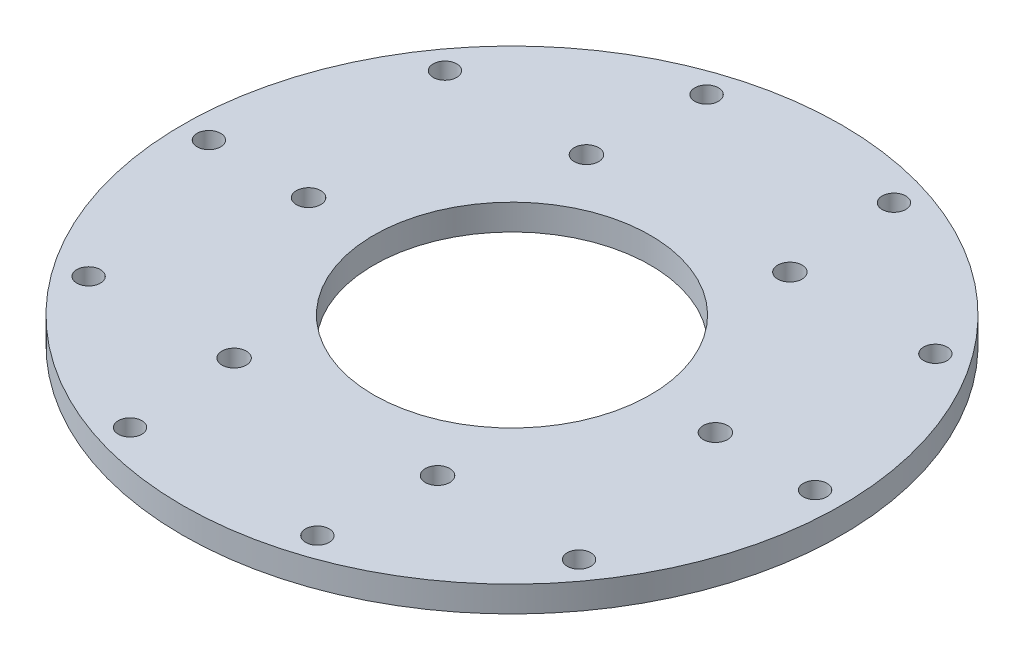
ISO-10303-21;
HEADER;
FILE_DESCRIPTION(('STEP AP214'),'2;1');
FILE_NAME('part.step','',(''),(''),'','','');
FILE_SCHEMA(('AUTOMOTIVE_DESIGN { 1 0 10303 214 1 1 1 1 }'));
ENDSEC;
DATA;
#1=APPLICATION_CONTEXT('core data for automotive mechanical design processes');
#2=APPLICATION_PROTOCOL_DEFINITION('international standard','automotive_design',2000,#1);
#3=PRODUCT_CONTEXT('',#1,'mechanical');
#4=PRODUCT('Part','Part','',(#3));
#5=PRODUCT_RELATED_PRODUCT_CATEGORY('part','',(#4));
#6=PRODUCT_DEFINITION_FORMATION('','',#4);
#7=PRODUCT_DEFINITION_CONTEXT('part definition',#1,'design');
#8=PRODUCT_DEFINITION('design','',#6,#7);
#9=PRODUCT_DEFINITION_SHAPE('','',#8);
#10=(LENGTH_UNIT() NAMED_UNIT(*) SI_UNIT(.MILLI.,.METRE.));
#11=(NAMED_UNIT(*) PLANE_ANGLE_UNIT() SI_UNIT($,.RADIAN.));
#12=(NAMED_UNIT(*) SI_UNIT($,.STERADIAN.) SOLID_ANGLE_UNIT());
#13=UNCERTAINTY_MEASURE_WITH_UNIT(LENGTH_MEASURE(1.E-05),#10,'distance_accuracy_value','');
#14=(GEOMETRIC_REPRESENTATION_CONTEXT(3) GLOBAL_UNCERTAINTY_ASSIGNED_CONTEXT((#13)) GLOBAL_UNIT_ASSIGNED_CONTEXT((#10,
#11,#12)) REPRESENTATION_CONTEXT('',''));
#15=CARTESIAN_POINT('',(0.,0.,0.));
#16=DIRECTION('',(0.,0.,1.));
#17=DIRECTION('',(1.,0.,0.));
#18=AXIS2_PLACEMENT_3D('',#15,#16,#17);
#19=CARTESIAN_POINT('',(0.,3.175,0.));
#20=DIRECTION('',(0.,1.,0.));
#21=DIRECTION('',(0.,0.,1.));
#22=AXIS2_PLACEMENT_3D('',#19,#20,#21);
#23=PLANE('',#22);
#24=CARTESIAN_POINT('',(11.5108830404665,3.175,35.4268552319946));
#25=DIRECTION('',(0.,1.,0.));
#26=DIRECTION('',(0.,0.,1.));
#27=AXIS2_PLACEMENT_3D('',#24,#25,#26);
#28=CIRCLE('',#27,1.45000000000001);
#29=CARTESIAN_POINT('',(11.5108830404665,3.175,36.8768552319946));
#30=VERTEX_POINT('',#29);
#31=EDGE_CURVE('E135',#30,#30,#28,.T.);
#32=ORIENTED_EDGE('',*,*,#31,.F.);
#33=EDGE_LOOP('',(#32));
#34=FACE_BOUND('',#33,.T.);
#35=CARTESIAN_POINT('',(37.25,3.175,2.60208521396521E-13));
#36=DIRECTION('',(0.,1.,0.));
#37=DIRECTION('',(0.,0.,1.));
#38=AXIS2_PLACEMENT_3D('',#35,#36,#37);
#39=CIRCLE('',#38,1.45);
#40=CARTESIAN_POINT('',(37.25,3.175,1.45000000000026));
#41=VERTEX_POINT('',#40);
#42=EDGE_CURVE('E123',#41,#41,#39,.T.);
#43=ORIENTED_EDGE('',*,*,#42,.F.);
#44=EDGE_LOOP('',(#43));
#45=FACE_BOUND('',#44,.T.);
#46=CARTESIAN_POINT('',(11.5108830404674,3.175,-35.4268552319943));
#47=DIRECTION('',(0.,1.,0.));
#48=DIRECTION('',(0.,0.,1.));
#49=AXIS2_PLACEMENT_3D('',#46,#47,#48);
#50=CIRCLE('',#49,1.44999999999999);
#51=CARTESIAN_POINT('',(11.5108830404674,3.175,-33.9768552319943));
#52=VERTEX_POINT('',#51);
#53=EDGE_CURVE('E111',#52,#52,#50,.T.);
#54=ORIENTED_EDGE('',*,*,#53,.F.);
#55=EDGE_LOOP('',(#54));
#56=FACE_BOUND('',#55,.T.);
#57=CARTESIAN_POINT('',(-11.5108830404672,3.175,35.4268552319944));
#58=DIRECTION('',(0.,1.,0.));
#59=DIRECTION('',(0.,0.,1.));
#60=AXIS2_PLACEMENT_3D('',#57,#58,#59);
#61=CIRCLE('',#60,1.45);
#62=CARTESIAN_POINT('',(-11.5108830404672,3.175,36.8768552319944));
#63=VERTEX_POINT('',#62);
#64=EDGE_CURVE('E99',#63,#63,#61,.T.);
#65=ORIENTED_EDGE('',*,*,#64,.F.);
#66=EDGE_LOOP('',(#65));
#67=FACE_BOUND('',#66,.T.);
#68=CARTESIAN_POINT('',(12.4999999999998,3.175,21.6506350946111));
#69=DIRECTION('',(0.,1.,0.));
#70=DIRECTION('',(0.,0.,1.));
#71=AXIS2_PLACEMENT_3D('',#68,#69,#70);
#72=CIRCLE('',#71,1.5);
#73=CARTESIAN_POINT('',(12.4999999999998,3.175,23.1506350946111));
#74=VERTEX_POINT('',#73);
#75=EDGE_CURVE('E87',#74,#74,#72,.T.);
#76=ORIENTED_EDGE('',*,*,#75,.F.);
#77=EDGE_LOOP('',(#76));
#78=FACE_BOUND('',#77,.T.);
#79=CARTESIAN_POINT('',(12.5000000000001,3.175,-21.6506350946109));
#80=DIRECTION('',(0.,1.,0.));
#81=DIRECTION('',(0.,0.,1.));
#82=AXIS2_PLACEMENT_3D('',#79,#80,#81);
#83=CIRCLE('',#82,1.5);
#84=CARTESIAN_POINT('',(12.5000000000001,3.175,-20.1506350946109));
#85=VERTEX_POINT('',#84);
#86=EDGE_CURVE('E75',#85,#85,#83,.T.);
#87=ORIENTED_EDGE('',*,*,#86,.F.);
#88=EDGE_LOOP('',(#87));
#89=FACE_BOUND('',#88,.T.);
#90=CARTESIAN_POINT('',(-30.1358830404665,3.175,-21.8950006478951));
#91=DIRECTION('',(0.,1.,0.));
#92=DIRECTION('',(0.,0.,1.));
#93=AXIS2_PLACEMENT_3D('',#90,#91,#92);
#94=CIRCLE('',#93,1.45);
#95=CARTESIAN_POINT('',(-30.1358830404665,3.175,-20.4450006478951));
#96=VERTEX_POINT('',#95);
#97=EDGE_CURVE('E63',#96,#96,#94,.T.);
#98=ORIENTED_EDGE('',*,*,#97,.F.);
#99=EDGE_LOOP('',(#98));
#100=FACE_BOUND('',#99,.T.);
#101=CARTESIAN_POINT('',(-37.25,3.175,0.));
#102=DIRECTION('',(0.,1.,0.));
#103=DIRECTION('',(0.,0.,1.));
#104=AXIS2_PLACEMENT_3D('',#101,#102,#103);
#105=CIRCLE('',#104,1.45);
#106=CARTESIAN_POINT('',(-37.25,3.175,1.45));
#107=VERTEX_POINT('',#106);
#108=EDGE_CURVE('E51',#107,#107,#105,.T.);
#109=ORIENTED_EDGE('',*,*,#108,.F.);
#110=EDGE_LOOP('',(#109));
#111=FACE_BOUND('',#110,.T.);
#112=CARTESIAN_POINT('',(0.,3.175,0.));
#113=DIRECTION('',(0.,1.,0.));
#114=DIRECTION('',(0.,0.,1.));
#115=AXIS2_PLACEMENT_3D('',#112,#113,#114);
#116=CIRCLE('',#115,40.5);
#117=CARTESIAN_POINT('',(0.,3.175,40.5));
#118=VERTEX_POINT('',#117);
#119=EDGE_CURVE('E10',#118,#118,#116,.T.);
#120=ORIENTED_EDGE('',*,*,#119,.T.);
#121=EDGE_LOOP('',(#120));
#122=FACE_BOUND('',#121,.T.);
#123=CARTESIAN_POINT('',(0.,3.175,0.));
#124=DIRECTION('',(0.,1.,0.));
#125=DIRECTION('',(0.,0.,1.));
#126=AXIS2_PLACEMENT_3D('',#123,#124,#125);
#127=CIRCLE('',#126,17.);
#128=CARTESIAN_POINT('',(0.,3.175,17.));
#129=VERTEX_POINT('',#128);
#130=EDGE_CURVE('E46',#129,#129,#127,.T.);
#131=ORIENTED_EDGE('',*,*,#130,.F.);
#132=EDGE_LOOP('',(#131));
#133=FACE_BOUND('',#132,.T.);
#134=CARTESIAN_POINT('',(-25.,3.175,0.));
#135=DIRECTION('',(0.,1.,0.));
#136=DIRECTION('',(0.,0.,1.));
#137=AXIS2_PLACEMENT_3D('',#134,#135,#136);
#138=CIRCLE('',#137,1.5);
#139=CARTESIAN_POINT('',(-25.,3.175,1.5));
#140=VERTEX_POINT('',#139);
#141=EDGE_CURVE('E57',#140,#140,#138,.T.);
#142=ORIENTED_EDGE('',*,*,#141,.F.);
#143=EDGE_LOOP('',(#142));
#144=FACE_BOUND('',#143,.T.);
#145=CARTESIAN_POINT('',(-12.5,3.175,-21.650635094611));
#146=DIRECTION('',(0.,1.,0.));
#147=DIRECTION('',(0.,0.,1.));
#148=AXIS2_PLACEMENT_3D('',#145,#146,#147);
#149=CIRCLE('',#148,1.50000000000002);
#150=CARTESIAN_POINT('',(-12.5,3.175,-20.1506350946109));
#151=VERTEX_POINT('',#150);
#152=EDGE_CURVE('E69',#151,#151,#149,.T.);
#153=ORIENTED_EDGE('',*,*,#152,.F.);
#154=EDGE_LOOP('',(#153));
#155=FACE_BOUND('',#154,.T.);
#156=CARTESIAN_POINT('',(25.,3.175,1.74574066942157E-13));
#157=DIRECTION('',(0.,1.,0.));
#158=DIRECTION('',(0.,0.,1.));
#159=AXIS2_PLACEMENT_3D('',#156,#157,#158);
#160=CIRCLE('',#159,1.5);
#161=CARTESIAN_POINT('',(25.,3.175,1.50000000000018));
#162=VERTEX_POINT('',#161);
#163=EDGE_CURVE('E81',#162,#162,#160,.T.);
#164=ORIENTED_EDGE('',*,*,#163,.F.);
#165=EDGE_LOOP('',(#164));
#166=FACE_BOUND('',#165,.T.);
#167=CARTESIAN_POINT('',(-12.5,3.175,21.650635094611));
#168=DIRECTION('',(0.,1.,0.));
#169=DIRECTION('',(0.,0.,1.));
#170=AXIS2_PLACEMENT_3D('',#167,#168,#169);
#171=CIRCLE('',#170,1.50000000000009);
#172=CARTESIAN_POINT('',(-12.5,3.175,23.1506350946111));
#173=VERTEX_POINT('',#172);
#174=EDGE_CURVE('E93',#173,#173,#171,.T.);
#175=ORIENTED_EDGE('',*,*,#174,.F.);
#176=EDGE_LOOP('',(#175));
#177=FACE_BOUND('',#176,.T.);
#178=CARTESIAN_POINT('',(-11.5108830404662,3.175,-35.4268552319947));
#179=DIRECTION('',(0.,1.,0.));
#180=DIRECTION('',(0.,0.,1.));
#181=AXIS2_PLACEMENT_3D('',#178,#179,#180);
#182=CIRCLE('',#181,1.45);
#183=CARTESIAN_POINT('',(-11.5108830404662,3.175,-33.9768552319947));
#184=VERTEX_POINT('',#183);
#185=EDGE_CURVE('E105',#184,#184,#182,.T.);
#186=ORIENTED_EDGE('',*,*,#185,.F.);
#187=EDGE_LOOP('',(#186));
#188=FACE_BOUND('',#187,.T.);
#189=CARTESIAN_POINT('',(30.1358830404668,3.175,-21.8950006478946));
#190=DIRECTION('',(0.,1.,0.));
#191=DIRECTION('',(0.,0.,1.));
#192=AXIS2_PLACEMENT_3D('',#189,#190,#191);
#193=CIRCLE('',#192,1.44999999999979);
#194=CARTESIAN_POINT('',(30.1358830404668,3.175,-20.4450006478948));
#195=VERTEX_POINT('',#194);
#196=EDGE_CURVE('E117',#195,#195,#193,.T.);
#197=ORIENTED_EDGE('',*,*,#196,.F.);
#198=EDGE_LOOP('',(#197));
#199=FACE_BOUND('',#198,.T.);
#200=CARTESIAN_POINT('',(30.1358830404666,3.175,21.8950006478949));
#201=DIRECTION('',(0.,1.,0.));
#202=DIRECTION('',(0.,0.,1.));
#203=AXIS2_PLACEMENT_3D('',#200,#201,#202);
#204=CIRCLE('',#203,1.45);
#205=CARTESIAN_POINT('',(30.1358830404666,3.175,23.3450006478949));
#206=VERTEX_POINT('',#205);
#207=EDGE_CURVE('E129',#206,#206,#204,.T.);
#208=ORIENTED_EDGE('',*,*,#207,.F.);
#209=EDGE_LOOP('',(#208));
#210=FACE_BOUND('',#209,.T.);
#211=CARTESIAN_POINT('',(-30.1358830404671,3.175,21.8950006478942));
#212=DIRECTION('',(0.,1.,0.));
#213=DIRECTION('',(0.,0.,1.));
#214=AXIS2_PLACEMENT_3D('',#211,#212,#213);
#215=CIRCLE('',#214,1.45);
#216=CARTESIAN_POINT('',(-30.1358830404671,3.175,23.3450006478942));
#217=VERTEX_POINT('',#216);
#218=EDGE_CURVE('E141',#217,#217,#215,.T.);
#219=ORIENTED_EDGE('',*,*,#218,.F.);
#220=EDGE_LOOP('',(#219));
#221=FACE_BOUND('',#220,.T.);
#222=ADVANCED_FACE('F35',(#34,#45,#56,#67,#78,#89,#100,#111,#122,#133,#144,#155,#166,#177,#188,
#199,#210,#221),#23,.T.);
#223=CARTESIAN_POINT('',(0.,0.,0.));
#224=DIRECTION('',(0.,1.,0.));
#225=DIRECTION('',(0.,0.,1.));
#226=AXIS2_PLACEMENT_3D('',#223,#224,#225);
#227=PLANE('',#226);
#228=CARTESIAN_POINT('',(0.,0.,0.));
#229=DIRECTION('',(0.,1.,0.));
#230=DIRECTION('',(0.,0.,1.));
#231=AXIS2_PLACEMENT_3D('',#228,#229,#230);
#232=CIRCLE('',#231,40.5);
#233=CARTESIAN_POINT('',(0.,0.,40.5));
#234=VERTEX_POINT('',#233);
#235=EDGE_CURVE('E39',#234,#234,#232,.T.);
#236=ORIENTED_EDGE('',*,*,#235,.F.);
#237=EDGE_LOOP('',(#236));
#238=FACE_BOUND('',#237,.T.);
#239=CARTESIAN_POINT('',(0.,0.,0.));
#240=DIRECTION('',(0.,1.,0.));
#241=DIRECTION('',(0.,0.,1.));
#242=AXIS2_PLACEMENT_3D('',#239,#240,#241);
#243=CIRCLE('',#242,17.);
#244=CARTESIAN_POINT('',(0.,0.,17.));
#245=VERTEX_POINT('',#244);
#246=EDGE_CURVE('E48',#245,#245,#243,.T.);
#247=ORIENTED_EDGE('',*,*,#246,.T.);
#248=EDGE_LOOP('',(#247));
#249=FACE_BOUND('',#248,.T.);
#250=CARTESIAN_POINT('',(-37.25,0.,0.));
#251=DIRECTION('',(0.,1.,0.));
#252=DIRECTION('',(0.,0.,1.));
#253=AXIS2_PLACEMENT_3D('',#250,#251,#252);
#254=CIRCLE('',#253,1.45);
#255=CARTESIAN_POINT('',(-37.25,0.,1.45));
#256=VERTEX_POINT('',#255);
#257=EDGE_CURVE('E54',#256,#256,#254,.T.);
#258=ORIENTED_EDGE('',*,*,#257,.T.);
#259=EDGE_LOOP('',(#258));
#260=FACE_BOUND('',#259,.T.);
#261=CARTESIAN_POINT('',(-25.,0.,0.));
#262=DIRECTION('',(0.,1.,0.));
#263=DIRECTION('',(0.,0.,1.));
#264=AXIS2_PLACEMENT_3D('',#261,#262,#263);
#265=CIRCLE('',#264,1.5);
#266=CARTESIAN_POINT('',(-25.,0.,1.5));
#267=VERTEX_POINT('',#266);
#268=EDGE_CURVE('E60',#267,#267,#265,.T.);
#269=ORIENTED_EDGE('',*,*,#268,.T.);
#270=EDGE_LOOP('',(#269));
#271=FACE_BOUND('',#270,.T.);
#272=CARTESIAN_POINT('',(-30.1358830404665,0.,-21.8950006478951));
#273=DIRECTION('',(0.,1.,0.));
#274=DIRECTION('',(0.,0.,1.));
#275=AXIS2_PLACEMENT_3D('',#272,#273,#274);
#276=CIRCLE('',#275,1.45);
#277=CARTESIAN_POINT('',(-30.1358830404665,0.,-20.4450006478951));
#278=VERTEX_POINT('',#277);
#279=EDGE_CURVE('E66',#278,#278,#276,.T.);
#280=ORIENTED_EDGE('',*,*,#279,.T.);
#281=EDGE_LOOP('',(#280));
#282=FACE_BOUND('',#281,.T.);
#283=CARTESIAN_POINT('',(-12.5,0.,-21.650635094611));
#284=DIRECTION('',(0.,1.,0.));
#285=DIRECTION('',(0.,0.,1.));
#286=AXIS2_PLACEMENT_3D('',#283,#284,#285);
#287=CIRCLE('',#286,1.50000000000002);
#288=CARTESIAN_POINT('',(-12.5,0.,-20.1506350946109));
#289=VERTEX_POINT('',#288);
#290=EDGE_CURVE('E72',#289,#289,#287,.T.);
#291=ORIENTED_EDGE('',*,*,#290,.T.);
#292=EDGE_LOOP('',(#291));
#293=FACE_BOUND('',#292,.T.);
#294=CARTESIAN_POINT('',(12.5000000000001,0.,-21.6506350946109));
#295=DIRECTION('',(0.,1.,0.));
#296=DIRECTION('',(0.,0.,1.));
#297=AXIS2_PLACEMENT_3D('',#294,#295,#296);
#298=CIRCLE('',#297,1.5);
#299=CARTESIAN_POINT('',(12.5000000000001,0.,-20.1506350946109));
#300=VERTEX_POINT('',#299);
#301=EDGE_CURVE('E78',#300,#300,#298,.T.);
#302=ORIENTED_EDGE('',*,*,#301,.T.);
#303=EDGE_LOOP('',(#302));
#304=FACE_BOUND('',#303,.T.);
#305=CARTESIAN_POINT('',(25.,0.,1.74574066942157E-13));
#306=DIRECTION('',(0.,1.,0.));
#307=DIRECTION('',(0.,0.,1.));
#308=AXIS2_PLACEMENT_3D('',#305,#306,#307);
#309=CIRCLE('',#308,1.5);
#310=CARTESIAN_POINT('',(25.,0.,1.50000000000018));
#311=VERTEX_POINT('',#310);
#312=EDGE_CURVE('E84',#311,#311,#309,.T.);
#313=ORIENTED_EDGE('',*,*,#312,.T.);
#314=EDGE_LOOP('',(#313));
#315=FACE_BOUND('',#314,.T.);
#316=CARTESIAN_POINT('',(12.4999999999998,0.,21.6506350946111));
#317=DIRECTION('',(0.,1.,0.));
#318=DIRECTION('',(0.,0.,1.));
#319=AXIS2_PLACEMENT_3D('',#316,#317,#318);
#320=CIRCLE('',#319,1.5);
#321=CARTESIAN_POINT('',(12.4999999999998,0.,23.1506350946111));
#322=VERTEX_POINT('',#321);
#323=EDGE_CURVE('E90',#322,#322,#320,.T.);
#324=ORIENTED_EDGE('',*,*,#323,.T.);
#325=EDGE_LOOP('',(#324));
#326=FACE_BOUND('',#325,.T.);
#327=CARTESIAN_POINT('',(-12.5,0.,21.650635094611));
#328=DIRECTION('',(0.,1.,0.));
#329=DIRECTION('',(0.,0.,1.));
#330=AXIS2_PLACEMENT_3D('',#327,#328,#329);
#331=CIRCLE('',#330,1.50000000000009);
#332=CARTESIAN_POINT('',(-12.5,0.,23.1506350946111));
#333=VERTEX_POINT('',#332);
#334=EDGE_CURVE('E96',#333,#333,#331,.T.);
#335=ORIENTED_EDGE('',*,*,#334,.T.);
#336=EDGE_LOOP('',(#335));
#337=FACE_BOUND('',#336,.T.);
#338=CARTESIAN_POINT('',(-11.5108830404672,0.,35.4268552319944));
#339=DIRECTION('',(0.,1.,0.));
#340=DIRECTION('',(0.,0.,1.));
#341=AXIS2_PLACEMENT_3D('',#338,#339,#340);
#342=CIRCLE('',#341,1.45);
#343=CARTESIAN_POINT('',(-11.5108830404672,0.,36.8768552319944));
#344=VERTEX_POINT('',#343);
#345=EDGE_CURVE('E102',#344,#344,#342,.T.);
#346=ORIENTED_EDGE('',*,*,#345,.T.);
#347=EDGE_LOOP('',(#346));
#348=FACE_BOUND('',#347,.T.);
#349=CARTESIAN_POINT('',(-11.5108830404662,0.,-35.4268552319947));
#350=DIRECTION('',(0.,1.,0.));
#351=DIRECTION('',(0.,0.,1.));
#352=AXIS2_PLACEMENT_3D('',#349,#350,#351);
#353=CIRCLE('',#352,1.45);
#354=CARTESIAN_POINT('',(-11.5108830404662,0.,-33.9768552319947));
#355=VERTEX_POINT('',#354);
#356=EDGE_CURVE('E108',#355,#355,#353,.T.);
#357=ORIENTED_EDGE('',*,*,#356,.T.);
#358=EDGE_LOOP('',(#357));
#359=FACE_BOUND('',#358,.T.);
#360=CARTESIAN_POINT('',(11.5108830404674,0.,-35.4268552319943));
#361=DIRECTION('',(0.,1.,0.));
#362=DIRECTION('',(0.,0.,1.));
#363=AXIS2_PLACEMENT_3D('',#360,#361,#362);
#364=CIRCLE('',#363,1.44999999999999);
#365=CARTESIAN_POINT('',(11.5108830404674,0.,-33.9768552319943));
#366=VERTEX_POINT('',#365);
#367=EDGE_CURVE('E114',#366,#366,#364,.T.);
#368=ORIENTED_EDGE('',*,*,#367,.T.);
#369=EDGE_LOOP('',(#368));
#370=FACE_BOUND('',#369,.T.);
#371=CARTESIAN_POINT('',(30.1358830404668,0.,-21.8950006478946));
#372=DIRECTION('',(0.,1.,0.));
#373=DIRECTION('',(0.,0.,1.));
#374=AXIS2_PLACEMENT_3D('',#371,#372,#373);
#375=CIRCLE('',#374,1.44999999999979);
#376=CARTESIAN_POINT('',(30.1358830404668,0.,-20.4450006478948));
#377=VERTEX_POINT('',#376);
#378=EDGE_CURVE('E120',#377,#377,#375,.T.);
#379=ORIENTED_EDGE('',*,*,#378,.T.);
#380=EDGE_LOOP('',(#379));
#381=FACE_BOUND('',#380,.T.);
#382=CARTESIAN_POINT('',(37.25,0.,2.60208521396521E-13));
#383=DIRECTION('',(0.,1.,0.));
#384=DIRECTION('',(0.,0.,1.));
#385=AXIS2_PLACEMENT_3D('',#382,#383,#384);
#386=CIRCLE('',#385,1.45);
#387=CARTESIAN_POINT('',(37.25,0.,1.45000000000026));
#388=VERTEX_POINT('',#387);
#389=EDGE_CURVE('E126',#388,#388,#386,.T.);
#390=ORIENTED_EDGE('',*,*,#389,.T.);
#391=EDGE_LOOP('',(#390));
#392=FACE_BOUND('',#391,.T.);
#393=CARTESIAN_POINT('',(30.1358830404666,0.,21.8950006478949));
#394=DIRECTION('',(0.,1.,0.));
#395=DIRECTION('',(0.,0.,1.));
#396=AXIS2_PLACEMENT_3D('',#393,#394,#395);
#397=CIRCLE('',#396,1.45);
#398=CARTESIAN_POINT('',(30.1358830404666,0.,23.3450006478949));
#399=VERTEX_POINT('',#398);
#400=EDGE_CURVE('E132',#399,#399,#397,.T.);
#401=ORIENTED_EDGE('',*,*,#400,.T.);
#402=EDGE_LOOP('',(#401));
#403=FACE_BOUND('',#402,.T.);
#404=CARTESIAN_POINT('',(11.5108830404665,0.,35.4268552319946));
#405=DIRECTION('',(0.,1.,0.));
#406=DIRECTION('',(0.,0.,1.));
#407=AXIS2_PLACEMENT_3D('',#404,#405,#406);
#408=CIRCLE('',#407,1.45000000000001);
#409=CARTESIAN_POINT('',(11.5108830404665,0.,36.8768552319946));
#410=VERTEX_POINT('',#409);
#411=EDGE_CURVE('E138',#410,#410,#408,.T.);
#412=ORIENTED_EDGE('',*,*,#411,.T.);
#413=EDGE_LOOP('',(#412));
#414=FACE_BOUND('',#413,.T.);
#415=CARTESIAN_POINT('',(-30.1358830404671,0.,21.8950006478942));
#416=DIRECTION('',(0.,1.,0.));
#417=DIRECTION('',(0.,0.,1.));
#418=AXIS2_PLACEMENT_3D('',#415,#416,#417);
#419=CIRCLE('',#418,1.45);
#420=CARTESIAN_POINT('',(-30.1358830404671,0.,23.3450006478942));
#421=VERTEX_POINT('',#420);
#422=EDGE_CURVE('E144',#421,#421,#419,.T.);
#423=ORIENTED_EDGE('',*,*,#422,.T.);
#424=EDGE_LOOP('',(#423));
#425=FACE_BOUND('',#424,.T.);
#426=ADVANCED_FACE('F154',(#238,#249,#260,#271,#282,#293,#304,#315,#326,#337,#348,#359,#370,
#381,#392,#403,#414,#425),#227,.F.);
#427=CARTESIAN_POINT('',(0.,3.175,0.));
#428=DIRECTION('',(0.,-1.,0.));
#429=DIRECTION('',(0.,0.,-1.));
#430=AXIS2_PLACEMENT_3D('',#427,#428,#429);
#431=CYLINDRICAL_SURFACE('',#430,40.5);
#432=ORIENTED_EDGE('',*,*,#119,.F.);
#433=EDGE_LOOP('',(#432));
#434=FACE_BOUND('',#433,.T.);
#435=ORIENTED_EDGE('',*,*,#235,.T.);
#436=EDGE_LOOP('',(#435));
#437=FACE_BOUND('',#436,.T.);
#438=ADVANCED_FACE('F37',(#434,#437),#431,.T.);
#439=CARTESIAN_POINT('',(0.,3.175,0.));
#440=DIRECTION('',(0.,-1.,0.));
#441=DIRECTION('',(0.,0.,-1.));
#442=AXIS2_PLACEMENT_3D('',#439,#440,#441);
#443=CYLINDRICAL_SURFACE('',#442,17.);
#444=ORIENTED_EDGE('',*,*,#130,.T.);
#445=EDGE_LOOP('',(#444));
#446=FACE_BOUND('',#445,.T.);
#447=ORIENTED_EDGE('',*,*,#246,.F.);
#448=EDGE_LOOP('',(#447));
#449=FACE_BOUND('',#448,.T.);
#450=ADVANCED_FACE('F164',(#446,#449),#443,.F.);
#451=CARTESIAN_POINT('',(-37.25,3.175,0.));
#452=DIRECTION('',(0.,-1.,0.));
#453=DIRECTION('',(0.,0.,-1.));
#454=AXIS2_PLACEMENT_3D('',#451,#452,#453);
#455=CYLINDRICAL_SURFACE('',#454,1.45);
#456=ORIENTED_EDGE('',*,*,#108,.T.);
#457=EDGE_LOOP('',(#456));
#458=FACE_BOUND('',#457,.T.);
#459=ORIENTED_EDGE('',*,*,#257,.F.);
#460=EDGE_LOOP('',(#459));
#461=FACE_BOUND('',#460,.T.);
#462=ADVANCED_FACE('F167',(#458,#461),#455,.F.);
#463=CARTESIAN_POINT('',(-25.,3.175,0.));
#464=DIRECTION('',(0.,-1.,0.));
#465=DIRECTION('',(0.,0.,-1.));
#466=AXIS2_PLACEMENT_3D('',#463,#464,#465);
#467=CYLINDRICAL_SURFACE('',#466,1.5);
#468=ORIENTED_EDGE('',*,*,#141,.T.);
#469=EDGE_LOOP('',(#468));
#470=FACE_BOUND('',#469,.T.);
#471=ORIENTED_EDGE('',*,*,#268,.F.);
#472=EDGE_LOOP('',(#471));
#473=FACE_BOUND('',#472,.T.);
#474=ADVANCED_FACE('F171',(#470,#473),#467,.F.);
#475=CARTESIAN_POINT('',(-30.1358830404665,3.175,-21.8950006478951));
#476=DIRECTION('',(0.,-1.,0.));
#477=DIRECTION('',(0.,0.,-1.));
#478=AXIS2_PLACEMENT_3D('',#475,#476,#477);
#479=CYLINDRICAL_SURFACE('',#478,1.45);
#480=ORIENTED_EDGE('',*,*,#97,.T.);
#481=EDGE_LOOP('',(#480));
#482=FACE_BOUND('',#481,.T.);
#483=ORIENTED_EDGE('',*,*,#279,.F.);
#484=EDGE_LOOP('',(#483));
#485=FACE_BOUND('',#484,.T.);
#486=ADVANCED_FACE('F175',(#482,#485),#479,.F.);
#487=CARTESIAN_POINT('',(-12.5,3.175,-21.650635094611));
#488=DIRECTION('',(0.,-1.,0.));
#489=DIRECTION('',(0.,0.,-1.));
#490=AXIS2_PLACEMENT_3D('',#487,#488,#489);
#491=CYLINDRICAL_SURFACE('',#490,1.50000000000002);
#492=ORIENTED_EDGE('',*,*,#152,.T.);
#493=EDGE_LOOP('',(#492));
#494=FACE_BOUND('',#493,.T.);
#495=ORIENTED_EDGE('',*,*,#290,.F.);
#496=EDGE_LOOP('',(#495));
#497=FACE_BOUND('',#496,.T.);
#498=ADVANCED_FACE('F179',(#494,#497),#491,.F.);
#499=CARTESIAN_POINT('',(12.5000000000001,3.175,-21.6506350946109));
#500=DIRECTION('',(0.,-1.,0.));
#501=DIRECTION('',(0.,0.,-1.));
#502=AXIS2_PLACEMENT_3D('',#499,#500,#501);
#503=CYLINDRICAL_SURFACE('',#502,1.5);
#504=ORIENTED_EDGE('',*,*,#86,.T.);
#505=EDGE_LOOP('',(#504));
#506=FACE_BOUND('',#505,.T.);
#507=ORIENTED_EDGE('',*,*,#301,.F.);
#508=EDGE_LOOP('',(#507));
#509=FACE_BOUND('',#508,.T.);
#510=ADVANCED_FACE('F183',(#506,#509),#503,.F.);
#511=CARTESIAN_POINT('',(25.,3.175,1.74574066942157E-13));
#512=DIRECTION('',(0.,-1.,0.));
#513=DIRECTION('',(0.,0.,-1.));
#514=AXIS2_PLACEMENT_3D('',#511,#512,#513);
#515=CYLINDRICAL_SURFACE('',#514,1.5);
#516=ORIENTED_EDGE('',*,*,#163,.T.);
#517=EDGE_LOOP('',(#516));
#518=FACE_BOUND('',#517,.T.);
#519=ORIENTED_EDGE('',*,*,#312,.F.);
#520=EDGE_LOOP('',(#519));
#521=FACE_BOUND('',#520,.T.);
#522=ADVANCED_FACE('F187',(#518,#521),#515,.F.);
#523=CARTESIAN_POINT('',(12.4999999999998,3.175,21.6506350946111));
#524=DIRECTION('',(0.,-1.,0.));
#525=DIRECTION('',(0.,0.,-1.));
#526=AXIS2_PLACEMENT_3D('',#523,#524,#525);
#527=CYLINDRICAL_SURFACE('',#526,1.5);
#528=ORIENTED_EDGE('',*,*,#75,.T.);
#529=EDGE_LOOP('',(#528));
#530=FACE_BOUND('',#529,.T.);
#531=ORIENTED_EDGE('',*,*,#323,.F.);
#532=EDGE_LOOP('',(#531));
#533=FACE_BOUND('',#532,.T.);
#534=ADVANCED_FACE('F191',(#530,#533),#527,.F.);
#535=CARTESIAN_POINT('',(-12.5,3.175,21.650635094611));
#536=DIRECTION('',(0.,-1.,0.));
#537=DIRECTION('',(0.,0.,-1.));
#538=AXIS2_PLACEMENT_3D('',#535,#536,#537);
#539=CYLINDRICAL_SURFACE('',#538,1.50000000000009);
#540=ORIENTED_EDGE('',*,*,#174,.T.);
#541=EDGE_LOOP('',(#540));
#542=FACE_BOUND('',#541,.T.);
#543=ORIENTED_EDGE('',*,*,#334,.F.);
#544=EDGE_LOOP('',(#543));
#545=FACE_BOUND('',#544,.T.);
#546=ADVANCED_FACE('F195',(#542,#545),#539,.F.);
#547=CARTESIAN_POINT('',(-11.5108830404672,3.175,35.4268552319944));
#548=DIRECTION('',(0.,-1.,0.));
#549=DIRECTION('',(0.,0.,-1.));
#550=AXIS2_PLACEMENT_3D('',#547,#548,#549);
#551=CYLINDRICAL_SURFACE('',#550,1.45);
#552=ORIENTED_EDGE('',*,*,#64,.T.);
#553=EDGE_LOOP('',(#552));
#554=FACE_BOUND('',#553,.T.);
#555=ORIENTED_EDGE('',*,*,#345,.F.);
#556=EDGE_LOOP('',(#555));
#557=FACE_BOUND('',#556,.T.);
#558=ADVANCED_FACE('F199',(#554,#557),#551,.F.);
#559=CARTESIAN_POINT('',(-11.5108830404662,3.175,-35.4268552319947));
#560=DIRECTION('',(0.,-1.,0.));
#561=DIRECTION('',(0.,0.,-1.));
#562=AXIS2_PLACEMENT_3D('',#559,#560,#561);
#563=CYLINDRICAL_SURFACE('',#562,1.45);
#564=ORIENTED_EDGE('',*,*,#185,.T.);
#565=EDGE_LOOP('',(#564));
#566=FACE_BOUND('',#565,.T.);
#567=ORIENTED_EDGE('',*,*,#356,.F.);
#568=EDGE_LOOP('',(#567));
#569=FACE_BOUND('',#568,.T.);
#570=ADVANCED_FACE('F203',(#566,#569),#563,.F.);
#571=CARTESIAN_POINT('',(11.5108830404674,3.175,-35.4268552319943));
#572=DIRECTION('',(0.,-1.,0.));
#573=DIRECTION('',(0.,0.,-1.));
#574=AXIS2_PLACEMENT_3D('',#571,#572,#573);
#575=CYLINDRICAL_SURFACE('',#574,1.44999999999999);
#576=ORIENTED_EDGE('',*,*,#53,.T.);
#577=EDGE_LOOP('',(#576));
#578=FACE_BOUND('',#577,.T.);
#579=ORIENTED_EDGE('',*,*,#367,.F.);
#580=EDGE_LOOP('',(#579));
#581=FACE_BOUND('',#580,.T.);
#582=ADVANCED_FACE('F207',(#578,#581),#575,.F.);
#583=CARTESIAN_POINT('',(30.1358830404668,3.175,-21.8950006478946));
#584=DIRECTION('',(0.,-1.,0.));
#585=DIRECTION('',(0.,0.,-1.));
#586=AXIS2_PLACEMENT_3D('',#583,#584,#585);
#587=CYLINDRICAL_SURFACE('',#586,1.44999999999979);
#588=ORIENTED_EDGE('',*,*,#196,.T.);
#589=EDGE_LOOP('',(#588));
#590=FACE_BOUND('',#589,.T.);
#591=ORIENTED_EDGE('',*,*,#378,.F.);
#592=EDGE_LOOP('',(#591));
#593=FACE_BOUND('',#592,.T.);
#594=ADVANCED_FACE('F211',(#590,#593),#587,.F.);
#595=CARTESIAN_POINT('',(37.25,3.175,2.60208521396521E-13));
#596=DIRECTION('',(0.,-1.,0.));
#597=DIRECTION('',(0.,0.,-1.));
#598=AXIS2_PLACEMENT_3D('',#595,#596,#597);
#599=CYLINDRICAL_SURFACE('',#598,1.45);
#600=ORIENTED_EDGE('',*,*,#42,.T.);
#601=EDGE_LOOP('',(#600));
#602=FACE_BOUND('',#601,.T.);
#603=ORIENTED_EDGE('',*,*,#389,.F.);
#604=EDGE_LOOP('',(#603));
#605=FACE_BOUND('',#604,.T.);
#606=ADVANCED_FACE('F215',(#602,#605),#599,.F.);
#607=CARTESIAN_POINT('',(30.1358830404666,3.175,21.8950006478949));
#608=DIRECTION('',(0.,-1.,0.));
#609=DIRECTION('',(0.,0.,-1.));
#610=AXIS2_PLACEMENT_3D('',#607,#608,#609);
#611=CYLINDRICAL_SURFACE('',#610,1.45);
#612=ORIENTED_EDGE('',*,*,#207,.T.);
#613=EDGE_LOOP('',(#612));
#614=FACE_BOUND('',#613,.T.);
#615=ORIENTED_EDGE('',*,*,#400,.F.);
#616=EDGE_LOOP('',(#615));
#617=FACE_BOUND('',#616,.T.);
#618=ADVANCED_FACE('F219',(#614,#617),#611,.F.);
#619=CARTESIAN_POINT('',(11.5108830404665,3.175,35.4268552319946));
#620=DIRECTION('',(0.,-1.,0.));
#621=DIRECTION('',(0.,0.,-1.));
#622=AXIS2_PLACEMENT_3D('',#619,#620,#621);
#623=CYLINDRICAL_SURFACE('',#622,1.45000000000001);
#624=ORIENTED_EDGE('',*,*,#31,.T.);
#625=EDGE_LOOP('',(#624));
#626=FACE_BOUND('',#625,.T.);
#627=ORIENTED_EDGE('',*,*,#411,.F.);
#628=EDGE_LOOP('',(#627));
#629=FACE_BOUND('',#628,.T.);
#630=ADVANCED_FACE('F223',(#626,#629),#623,.F.);
#631=CARTESIAN_POINT('',(-30.1358830404671,3.175,21.8950006478942));
#632=DIRECTION('',(0.,-1.,0.));
#633=DIRECTION('',(0.,0.,-1.));
#634=AXIS2_PLACEMENT_3D('',#631,#632,#633);
#635=CYLINDRICAL_SURFACE('',#634,1.45);
#636=ORIENTED_EDGE('',*,*,#218,.T.);
#637=EDGE_LOOP('',(#636));
#638=FACE_BOUND('',#637,.T.);
#639=ORIENTED_EDGE('',*,*,#422,.F.);
#640=EDGE_LOOP('',(#639));
#641=FACE_BOUND('',#640,.T.);
#642=ADVANCED_FACE('F150',(#638,#641),#635,.F.);
#643=CLOSED_SHELL('',(#222,#426,#438,#450,#462,#474,#486,#498,#510,#522,#534,#546,#558,#570,
#582,#594,#606,#618,#630,#642));
#644=MANIFOLD_SOLID_BREP('B2',#643);
#645=ADVANCED_BREP_SHAPE_REPRESENTATION('',(#18,#644),#14);
#646=SHAPE_DEFINITION_REPRESENTATION(#9,#645);
ENDSEC;
END-ISO-10303-21;
